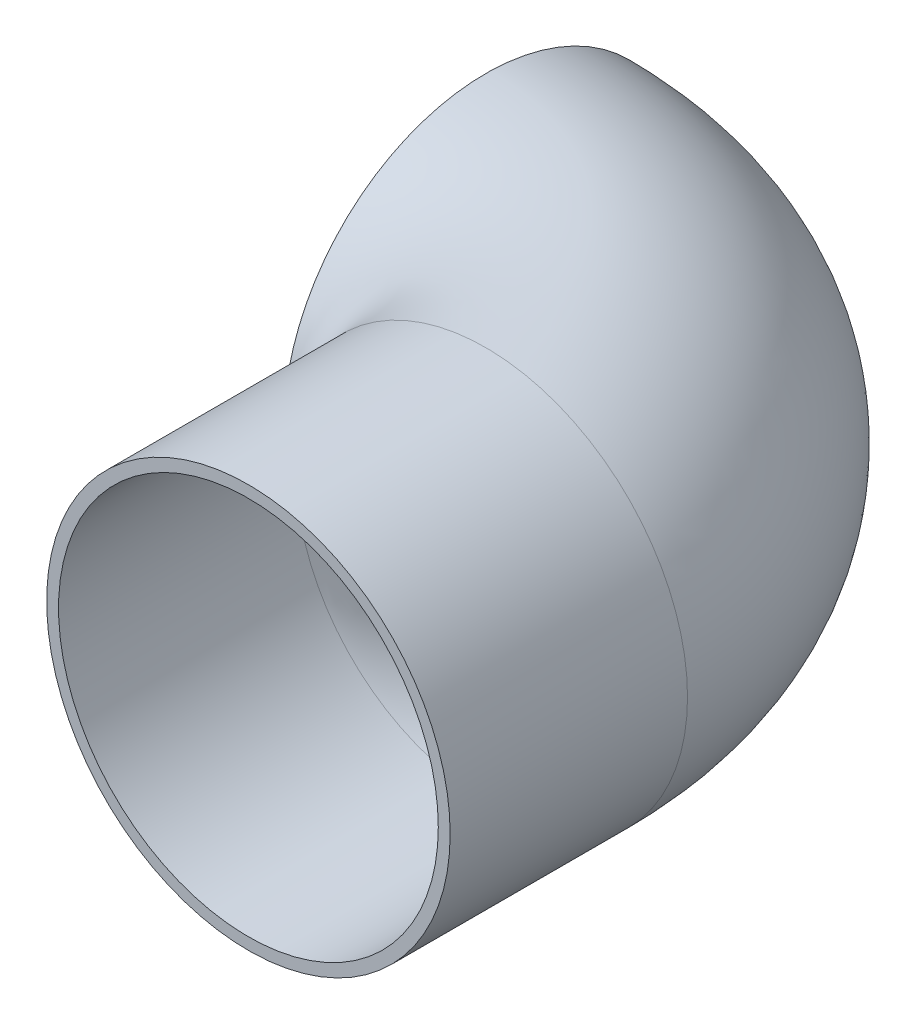
ISO-10303-21;
HEADER;
FILE_DESCRIPTION(('STEP AP214'),'2;1');
FILE_NAME('part.step','',(''),(''),'','','');
FILE_SCHEMA(('AUTOMOTIVE_DESIGN { 1 0 10303 214 1 1 1 1 }'));
ENDSEC;
DATA;
#1=APPLICATION_CONTEXT('core data for automotive mechanical design processes');
#2=APPLICATION_PROTOCOL_DEFINITION('international standard','automotive_design',2000,#1);
#3=PRODUCT_CONTEXT('',#1,'mechanical');
#4=PRODUCT('Part','Part','',(#3));
#5=PRODUCT_RELATED_PRODUCT_CATEGORY('part','',(#4));
#6=PRODUCT_DEFINITION_FORMATION('','',#4);
#7=PRODUCT_DEFINITION_CONTEXT('part definition',#1,'design');
#8=PRODUCT_DEFINITION('design','',#6,#7);
#9=PRODUCT_DEFINITION_SHAPE('','',#8);
#10=(LENGTH_UNIT() NAMED_UNIT(*) SI_UNIT(.MILLI.,.METRE.));
#11=(NAMED_UNIT(*) PLANE_ANGLE_UNIT() SI_UNIT($,.RADIAN.));
#12=(NAMED_UNIT(*) SI_UNIT($,.STERADIAN.) SOLID_ANGLE_UNIT());
#13=UNCERTAINTY_MEASURE_WITH_UNIT(LENGTH_MEASURE(1.E-05),#10,'distance_accuracy_value','');
#14=(GEOMETRIC_REPRESENTATION_CONTEXT(3) GLOBAL_UNCERTAINTY_ASSIGNED_CONTEXT((#13)) GLOBAL_UNIT_ASSIGNED_CONTEXT((#10,
#11,#12)) REPRESENTATION_CONTEXT('',''));
#15=CARTESIAN_POINT('',(0.,0.,0.));
#16=DIRECTION('',(0.,0.,1.));
#17=DIRECTION('',(1.,0.,0.));
#18=AXIS2_PLACEMENT_3D('',#15,#16,#17);
#19=CARTESIAN_POINT('',(0.,0.,0.));
#20=DIRECTION('',(0.,0.,-1.));
#21=DIRECTION('',(-1.,0.,0.));
#22=AXIS2_PLACEMENT_3D('',#19,#20,#21);
#23=CYLINDRICAL_SURFACE('',#22,8.5);
#24=CARTESIAN_POINT('',(0.,0.,-10.));
#25=DIRECTION('',(0.,0.,1.));
#26=DIRECTION('',(1.,0.,0.));
#27=AXIS2_PLACEMENT_3D('',#24,#25,#26);
#28=CIRCLE('',#27,8.5);
#29=CARTESIAN_POINT('',(8.5,0.,-10.));
#30=VERTEX_POINT('',#29);
#31=EDGE_CURVE('E43',#30,#30,#28,.T.);
#32=ORIENTED_EDGE('',*,*,#31,.T.);
#33=EDGE_LOOP('',(#32));
#34=FACE_BOUND('',#33,.T.);
#35=CARTESIAN_POINT('',(0.,0.,0.));
#36=DIRECTION('',(0.,0.,1.));
#37=DIRECTION('',(1.,0.,0.));
#38=AXIS2_PLACEMENT_3D('',#35,#36,#37);
#39=CIRCLE('',#38,8.5);
#40=CARTESIAN_POINT('',(8.5,0.,0.));
#41=VERTEX_POINT('',#40);
#42=EDGE_CURVE('E58',#41,#41,#39,.T.);
#43=ORIENTED_EDGE('',*,*,#42,.F.);
#44=EDGE_LOOP('',(#43));
#45=FACE_BOUND('',#44,.T.);
#46=ADVANCED_FACE('F39',(#34,#45),#23,.T.);
#47=CARTESIAN_POINT('',(-10.,0.,-10.));
#48=DIRECTION('',(0.,1.,0.));
#49=DIRECTION('',(0.,0.,1.));
#50=AXIS2_PLACEMENT_3D('',#47,#48,#49);
#51=TOROIDAL_SURFACE('',#50,10.,8.5);
#52=CARTESIAN_POINT('',(-9.99999999999999,0.,-20.));
#53=DIRECTION('',(1.,0.,0.));
#54=DIRECTION('',(0.,0.,-1.));
#55=AXIS2_PLACEMENT_3D('',#52,#53,#54);
#56=CIRCLE('',#55,8.5);
#57=CARTESIAN_POINT('',(-9.99999999999999,0.,-28.5));
#58=VERTEX_POINT('',#57);
#59=EDGE_CURVE('E56',#58,#58,#56,.T.);
#60=CARTESIAN_POINT('',(-10.,0.,-10.));
#61=DIRECTION('',(0.,1.,0.));
#62=DIRECTION('',(0.,0.,1.));
#63=AXIS2_PLACEMENT_3D('',#60,#61,#62);
#64=CIRCLE('',#63,18.5);
#65=EDGE_CURVE('',#30,#58,#64,.T.);
#66=ORIENTED_EDGE('',*,*,#31,.F.);
#67=ORIENTED_EDGE('',*,*,#59,.T.);
#68=ORIENTED_EDGE('',*,*,#65,.T.);
#69=ORIENTED_EDGE('',*,*,#65,.F.);
#70=EDGE_LOOP('',(#66,#68,#67,#69));
#71=FACE_BOUND('',#70,.T.);
#72=ADVANCED_FACE('F41',(#71),#51,.T.);
#73=CARTESIAN_POINT('',(0.,0.,0.));
#74=DIRECTION('',(0.,0.,1.));
#75=DIRECTION('',(1.,0.,0.));
#76=AXIS2_PLACEMENT_3D('',#73,#74,#75);
#77=PLANE('',#76);
#78=CARTESIAN_POINT('',(0.,0.,0.));
#79=DIRECTION('',(0.,0.,1.));
#80=DIRECTION('',(1.,0.,0.));
#81=AXIS2_PLACEMENT_3D('',#78,#79,#80);
#82=CIRCLE('',#81,8.);
#83=CARTESIAN_POINT('',(8.,0.,0.));
#84=VERTEX_POINT('',#83);
#85=EDGE_CURVE('E52',#84,#84,#82,.F.);
#86=ORIENTED_EDGE('',*,*,#85,.T.);
#87=EDGE_LOOP('',(#86));
#88=FACE_BOUND('',#87,.T.);
#89=ORIENTED_EDGE('',*,*,#42,.T.);
#90=EDGE_LOOP('',(#89));
#91=FACE_BOUND('',#90,.T.);
#92=ADVANCED_FACE('F68',(#88,#91),#77,.T.);
#93=CARTESIAN_POINT('',(-9.99999999999999,0.,-20.));
#94=DIRECTION('',(1.,0.,0.));
#95=DIRECTION('',(0.,0.,-1.));
#96=AXIS2_PLACEMENT_3D('',#93,#94,#95);
#97=PLANE('',#96);
#98=CARTESIAN_POINT('',(-9.99999999999999,0.,-20.));
#99=DIRECTION('',(1.,0.,0.));
#100=DIRECTION('',(0.,0.,-1.));
#101=AXIS2_PLACEMENT_3D('',#98,#99,#100);
#102=CIRCLE('',#101,8.);
#103=CARTESIAN_POINT('',(-9.99999999999999,0.,-28.));
#104=VERTEX_POINT('',#103);
#105=EDGE_CURVE('E10',#104,#104,#102,.F.);
#106=ORIENTED_EDGE('',*,*,#105,.F.);
#107=EDGE_LOOP('',(#106));
#108=FACE_BOUND('',#107,.T.);
#109=ORIENTED_EDGE('',*,*,#59,.F.);
#110=EDGE_LOOP('',(#109));
#111=FACE_BOUND('',#110,.T.);
#112=ADVANCED_FACE('F74',(#108,#111),#97,.F.);
#113=CARTESIAN_POINT('',(0.,0.,0.));
#114=DIRECTION('',(0.,0.,-1.));
#115=DIRECTION('',(-1.,0.,0.));
#116=AXIS2_PLACEMENT_3D('',#113,#114,#115);
#117=CYLINDRICAL_SURFACE('',#116,8.);
#118=CARTESIAN_POINT('',(0.,0.,-10.));
#119=DIRECTION('',(0.,0.,1.));
#120=DIRECTION('',(1.,0.,0.));
#121=AXIS2_PLACEMENT_3D('',#118,#119,#120);
#122=CIRCLE('',#121,8.);
#123=CARTESIAN_POINT('',(8.,0.,-10.));
#124=VERTEX_POINT('',#123);
#125=EDGE_CURVE('E47',#124,#124,#122,.F.);
#126=ORIENTED_EDGE('',*,*,#125,.T.);
#127=EDGE_LOOP('',(#126));
#128=FACE_BOUND('',#127,.T.);
#129=ORIENTED_EDGE('',*,*,#85,.F.);
#130=EDGE_LOOP('',(#129));
#131=FACE_BOUND('',#130,.T.);
#132=ADVANCED_FACE('F79',(#128,#131),#117,.F.);
#133=CARTESIAN_POINT('',(-10.,0.,-10.));
#134=DIRECTION('',(0.,1.,0.));
#135=DIRECTION('',(0.,0.,1.));
#136=AXIS2_PLACEMENT_3D('',#133,#134,#135);
#137=TOROIDAL_SURFACE('',#136,10.,8.);
#138=CARTESIAN_POINT('',(-10.,0.,-10.));
#139=DIRECTION('',(0.,1.,0.));
#140=DIRECTION('',(0.,0.,1.));
#141=AXIS2_PLACEMENT_3D('',#138,#139,#140);
#142=CIRCLE('',#141,18.);
#143=EDGE_CURVE('',#124,#104,#142,.T.);
#144=ORIENTED_EDGE('',*,*,#125,.F.);
#145=ORIENTED_EDGE('',*,*,#105,.T.);
#146=ORIENTED_EDGE('',*,*,#143,.T.);
#147=ORIENTED_EDGE('',*,*,#143,.F.);
#148=EDGE_LOOP('',(#144,#146,#145,#147));
#149=FACE_BOUND('',#148,.T.);
#150=ADVANCED_FACE('F77',(#149),#137,.F.);
#151=CLOSED_SHELL('',(#46,#72,#92,#112,#132,#150));
#152=MANIFOLD_SOLID_BREP('B2',#151);
#153=ADVANCED_BREP_SHAPE_REPRESENTATION('',(#18,#152),#14);
#154=SHAPE_DEFINITION_REPRESENTATION(#9,#153);
ENDSEC;
END-ISO-10303-21;
